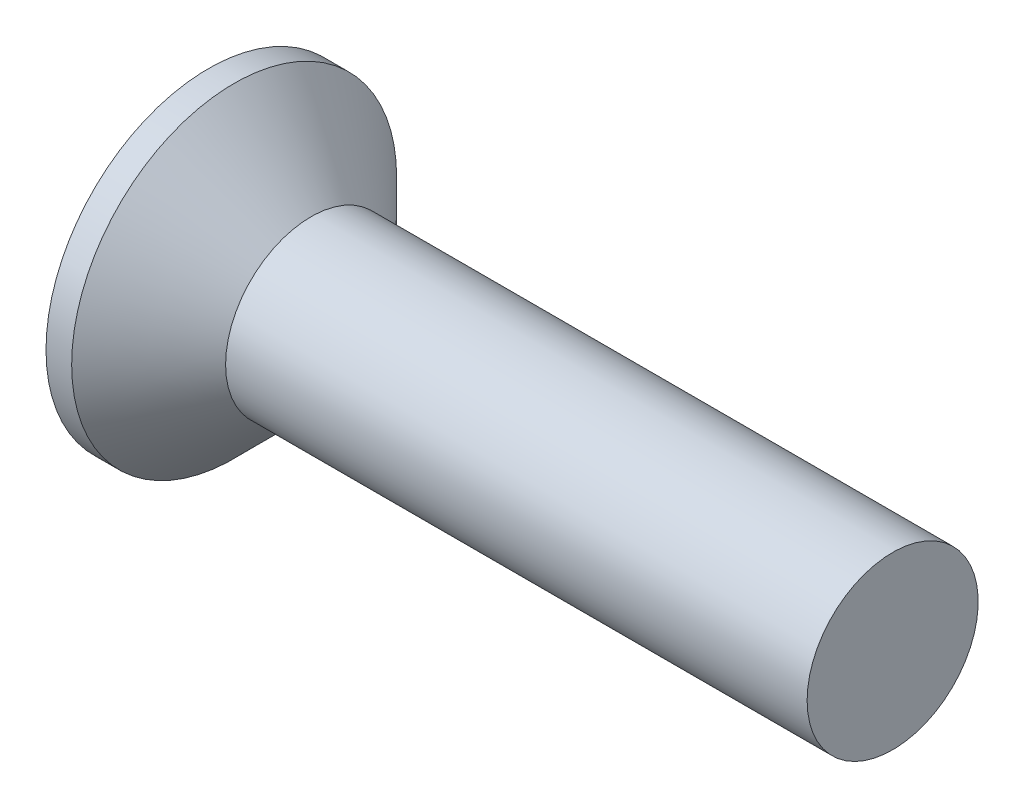
ISO-10303-21;
HEADER;
FILE_DESCRIPTION(('STEP AP214'),'2;1');
FILE_NAME('part.step','',(''),(''),'','','');
FILE_SCHEMA(('AUTOMOTIVE_DESIGN { 1 0 10303 214 1 1 1 1 }'));
ENDSEC;
DATA;
#1=APPLICATION_CONTEXT('core data for automotive mechanical design processes');
#2=APPLICATION_PROTOCOL_DEFINITION('international standard','automotive_design',2000,#1);
#3=PRODUCT_CONTEXT('',#1,'mechanical');
#4=PRODUCT('Part','Part','',(#3));
#5=PRODUCT_RELATED_PRODUCT_CATEGORY('part','',(#4));
#6=PRODUCT_DEFINITION_FORMATION('','',#4);
#7=PRODUCT_DEFINITION_CONTEXT('part definition',#1,'design');
#8=PRODUCT_DEFINITION('design','',#6,#7);
#9=PRODUCT_DEFINITION_SHAPE('','',#8);
#10=(LENGTH_UNIT() NAMED_UNIT(*) SI_UNIT(.MILLI.,.METRE.));
#11=(NAMED_UNIT(*) PLANE_ANGLE_UNIT() SI_UNIT($,.RADIAN.));
#12=(NAMED_UNIT(*) SI_UNIT($,.STERADIAN.) SOLID_ANGLE_UNIT());
#13=UNCERTAINTY_MEASURE_WITH_UNIT(LENGTH_MEASURE(1.E-05),#10,'distance_accuracy_value','');
#14=(GEOMETRIC_REPRESENTATION_CONTEXT(3) GLOBAL_UNCERTAINTY_ASSIGNED_CONTEXT((#13)) GLOBAL_UNIT_ASSIGNED_CONTEXT((#10,
#11,#12)) REPRESENTATION_CONTEXT('',''));
#15=CARTESIAN_POINT('',(0.,0.,0.));
#16=DIRECTION('',(0.,0.,1.));
#17=DIRECTION('',(1.,0.,0.));
#18=AXIS2_PLACEMENT_3D('',#15,#16,#17);
#19=CARTESIAN_POINT('',(0.,0.,0.));
#20=DIRECTION('',(-1.,0.,0.));
#21=DIRECTION('',(0.,0.,1.));
#22=AXIS2_PLACEMENT_3D('',#19,#20,#21);
#23=PLANE('',#22);
#24=CARTESIAN_POINT('',(0.,0.,0.));
#25=DIRECTION('',(-1.,0.,0.));
#26=DIRECTION('',(0.,0.,1.));
#27=AXIS2_PLACEMENT_3D('',#24,#25,#26);
#28=CIRCLE('',#27,1.9);
#29=CARTESIAN_POINT('',(0.,0.,1.9));
#30=VERTEX_POINT('',#29);
#31=EDGE_CURVE('E10',#30,#30,#28,.T.);
#32=ORIENTED_EDGE('',*,*,#31,.T.);
#33=EDGE_LOOP('',(#32));
#34=FACE_BOUND('',#33,.T.);
#35=ADVANCED_FACE('F33',(#34),#23,.T.);
#36=CARTESIAN_POINT('',(-6.34999999999999,0.,0.));
#37=DIRECTION('',(-1.,0.,0.));
#38=DIRECTION('',(0.,0.,1.));
#39=AXIS2_PLACEMENT_3D('',#36,#37,#38);
#40=CYLINDRICAL_SURFACE('',#39,1.9);
#41=CARTESIAN_POINT('',(0.300000000000004,0.,0.));
#42=DIRECTION('',(-1.,0.,0.));
#43=DIRECTION('',(0.,0.,1.));
#44=AXIS2_PLACEMENT_3D('',#41,#42,#43);
#45=CIRCLE('',#44,1.9);
#46=CARTESIAN_POINT('',(0.300000000000004,0.,1.9));
#47=VERTEX_POINT('',#46);
#48=EDGE_CURVE('E39',#47,#47,#45,.T.);
#49=ORIENTED_EDGE('',*,*,#48,.T.);
#50=EDGE_LOOP('',(#49));
#51=FACE_BOUND('',#50,.T.);
#52=ORIENTED_EDGE('',*,*,#31,.F.);
#53=EDGE_LOOP('',(#52));
#54=FACE_BOUND('',#53,.T.);
#55=ADVANCED_FACE('F65',(#51,#54),#40,.T.);
#56=CARTESIAN_POINT('',(0.300000000000004,0.,0.));
#57=DIRECTION('',(-1.,0.,0.));
#58=DIRECTION('',(0.,0.,1.));
#59=AXIS2_PLACEMENT_3D('',#56,#57,#58);
#60=CONICAL_SURFACE('',#59,1.9,0.785398163397451);
#61=CARTESIAN_POINT('',(1.2,0.,0.));
#62=DIRECTION('',(-1.,0.,0.));
#63=DIRECTION('',(0.,0.,1.));
#64=AXIS2_PLACEMENT_3D('',#61,#62,#63);
#65=CIRCLE('',#64,1.);
#66=CARTESIAN_POINT('',(1.2,0.,1.));
#67=VERTEX_POINT('',#66);
#68=EDGE_CURVE('E43',#67,#67,#65,.T.);
#69=ORIENTED_EDGE('',*,*,#68,.T.);
#70=EDGE_LOOP('',(#69));
#71=FACE_BOUND('',#70,.T.);
#72=ORIENTED_EDGE('',*,*,#48,.F.);
#73=EDGE_LOOP('',(#72));
#74=FACE_BOUND('',#73,.T.);
#75=ADVANCED_FACE('F62',(#71,#74),#60,.T.);
#76=CARTESIAN_POINT('',(-6.34999999999999,0.,0.));
#77=DIRECTION('',(-1.,0.,0.));
#78=DIRECTION('',(0.,0.,1.));
#79=AXIS2_PLACEMENT_3D('',#76,#77,#78);
#80=CYLINDRICAL_SURFACE('',#79,1.);
#81=CARTESIAN_POINT('',(8.,0.,0.));
#82=DIRECTION('',(-1.,0.,0.));
#83=DIRECTION('',(0.,0.,1.));
#84=AXIS2_PLACEMENT_3D('',#81,#82,#83);
#85=CIRCLE('',#84,1.);
#86=CARTESIAN_POINT('',(8.,0.,1.));
#87=VERTEX_POINT('',#86);
#88=EDGE_CURVE('E47',#87,#87,#85,.T.);
#89=ORIENTED_EDGE('',*,*,#88,.T.);
#90=EDGE_LOOP('',(#89));
#91=FACE_BOUND('',#90,.T.);
#92=ORIENTED_EDGE('',*,*,#68,.F.);
#93=EDGE_LOOP('',(#92));
#94=FACE_BOUND('',#93,.T.);
#95=ADVANCED_FACE('F53',(#91,#94),#80,.T.);
#96=CARTESIAN_POINT('',(8.,1.,0.));
#97=DIRECTION('',(1.,0.,0.));
#98=DIRECTION('',(0.,0.,-1.));
#99=AXIS2_PLACEMENT_3D('',#96,#97,#98);
#100=PLANE('',#99);
#101=ORIENTED_EDGE('',*,*,#88,.F.);
#102=EDGE_LOOP('',(#101));
#103=FACE_BOUND('',#102,.T.);
#104=ADVANCED_FACE('F56',(#103),#100,.T.);
#105=CLOSED_SHELL('',(#35,#55,#75,#95,#104));
#106=MANIFOLD_SOLID_BREP('B2',#105);
#107=ADVANCED_BREP_SHAPE_REPRESENTATION('',(#18,#106),#14);
#108=SHAPE_DEFINITION_REPRESENTATION(#9,#107);
ENDSEC;
END-ISO-10303-21;
